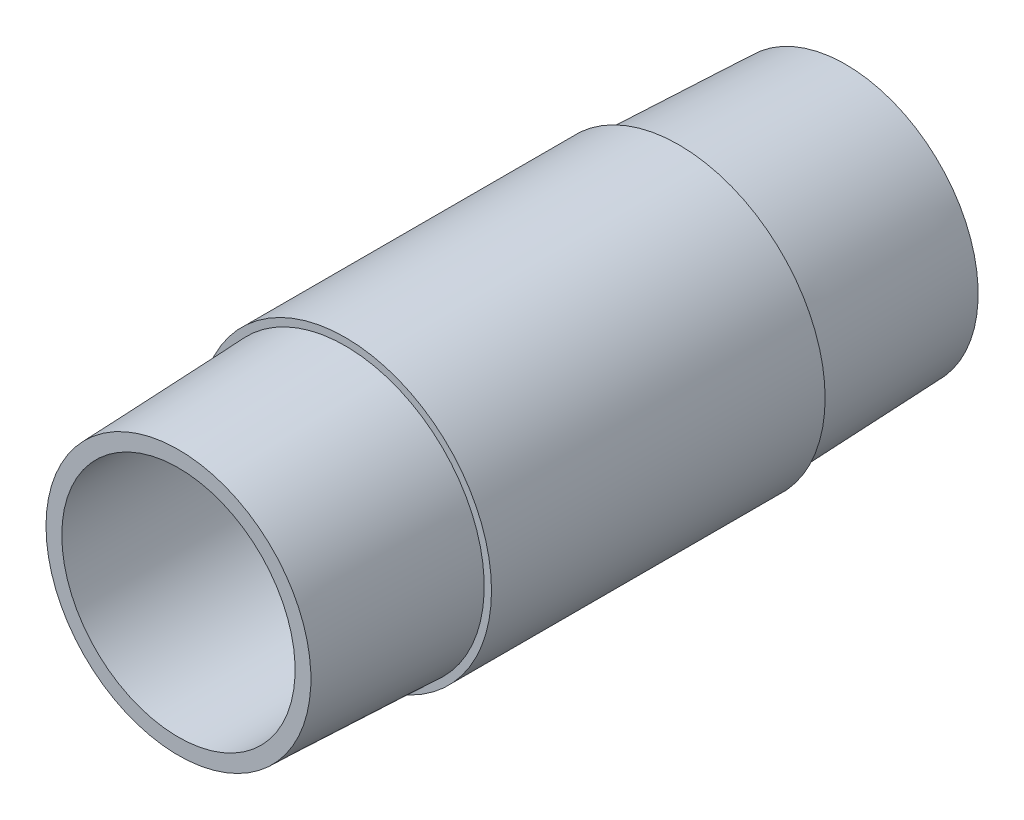
ISO-10303-21;
HEADER;
FILE_DESCRIPTION(('STEP AP214'),'2;1');
FILE_NAME('part.step','',(''),(''),'','','');
FILE_SCHEMA(('AUTOMOTIVE_DESIGN { 1 0 10303 214 1 1 1 1 }'));
ENDSEC;
DATA;
#1=APPLICATION_CONTEXT('core data for automotive mechanical design processes');
#2=APPLICATION_PROTOCOL_DEFINITION('international standard','automotive_design',2000,#1);
#3=PRODUCT_CONTEXT('',#1,'mechanical');
#4=PRODUCT('Part','Part','',(#3));
#5=PRODUCT_RELATED_PRODUCT_CATEGORY('part','',(#4));
#6=PRODUCT_DEFINITION_FORMATION('','',#4);
#7=PRODUCT_DEFINITION_CONTEXT('part definition',#1,'design');
#8=PRODUCT_DEFINITION('design','',#6,#7);
#9=PRODUCT_DEFINITION_SHAPE('','',#8);
#10=(LENGTH_UNIT() NAMED_UNIT(*) SI_UNIT(.MILLI.,.METRE.));
#11=(NAMED_UNIT(*) PLANE_ANGLE_UNIT() SI_UNIT($,.RADIAN.));
#12=(NAMED_UNIT(*) SI_UNIT($,.STERADIAN.) SOLID_ANGLE_UNIT());
#13=UNCERTAINTY_MEASURE_WITH_UNIT(LENGTH_MEASURE(1.E-05),#10,'distance_accuracy_value','');
#14=(GEOMETRIC_REPRESENTATION_CONTEXT(3) GLOBAL_UNCERTAINTY_ASSIGNED_CONTEXT((#13)) GLOBAL_UNIT_ASSIGNED_CONTEXT((#10,
#11,#12)) REPRESENTATION_CONTEXT('',''));
#15=CARTESIAN_POINT('',(0.,0.,0.));
#16=DIRECTION('',(0.,0.,1.));
#17=DIRECTION('',(1.,0.,0.));
#18=AXIS2_PLACEMENT_3D('',#15,#16,#17);
#19=CARTESIAN_POINT('',(0.,0.,76.2));
#20=DIRECTION('',(0.,0.,1.));
#21=DIRECTION('',(1.,0.,0.));
#22=AXIS2_PLACEMENT_3D('',#19,#20,#21);
#23=PLANE('',#22);
#24=CARTESIAN_POINT('',(0.,0.,76.2));
#25=DIRECTION('',(0.,0.,-1.));
#26=DIRECTION('',(-1.,0.,0.));
#27=AXIS2_PLACEMENT_3D('',#24,#25,#26);
#28=CIRCLE('',#27,15.1262084529017);
#29=CARTESIAN_POINT('',(-15.1262084529017,0.,76.2));
#30=VERTEX_POINT('',#29);
#31=EDGE_CURVE('E60',#30,#30,#28,.T.);
#32=ORIENTED_EDGE('',*,*,#31,.F.);
#33=EDGE_LOOP('',(#32));
#34=FACE_BOUND('',#33,.T.);
#35=CARTESIAN_POINT('',(0.,0.,76.2));
#36=DIRECTION('',(0.,0.,1.));
#37=DIRECTION('',(1.,0.,0.));
#38=AXIS2_PLACEMENT_3D('',#35,#36,#37);
#39=CIRCLE('',#38,13.3223);
#40=CARTESIAN_POINT('',(-13.3223,0.,76.2));
#41=VERTEX_POINT('',#40);
#42=EDGE_CURVE('E10',#41,#41,#39,.T.);
#43=ORIENTED_EDGE('',*,*,#42,.F.);
#44=EDGE_LOOP('',(#43));
#45=FACE_BOUND('',#44,.T.);
#46=ADVANCED_FACE('F31',(#34,#45),#23,.T.);
#47=CARTESIAN_POINT('',(0.,0.,0.));
#48=DIRECTION('',(0.,0.,1.));
#49=DIRECTION('',(1.,0.,0.));
#50=AXIS2_PLACEMENT_3D('',#47,#48,#49);
#51=PLANE('',#50);
#52=CARTESIAN_POINT('',(0.,0.,0.));
#53=DIRECTION('',(0.,0.,-1.));
#54=DIRECTION('',(-1.,0.,0.));
#55=AXIS2_PLACEMENT_3D('',#52,#53,#54);
#56=CIRCLE('',#55,15.1262084529017);
#57=CARTESIAN_POINT('',(-15.1262084529017,0.,0.));
#58=VERTEX_POINT('',#57);
#59=EDGE_CURVE('E53',#58,#58,#56,.T.);
#60=ORIENTED_EDGE('',*,*,#59,.T.);
#61=EDGE_LOOP('',(#60));
#62=FACE_BOUND('',#61,.T.);
#63=CARTESIAN_POINT('',(0.,0.,0.));
#64=DIRECTION('',(0.,0.,1.));
#65=DIRECTION('',(1.,0.,0.));
#66=AXIS2_PLACEMENT_3D('',#63,#64,#65);
#67=CIRCLE('',#66,13.3223);
#68=CARTESIAN_POINT('',(-13.3223,0.,0.));
#69=VERTEX_POINT('',#68);
#70=EDGE_CURVE('E39',#69,#69,#67,.T.);
#71=ORIENTED_EDGE('',*,*,#70,.T.);
#72=EDGE_LOOP('',(#71));
#73=FACE_BOUND('',#72,.T.);
#74=ADVANCED_FACE('F79',(#62,#73),#51,.F.);
#75=CARTESIAN_POINT('',(0.,0.,76.2));
#76=DIRECTION('',(0.,0.,-1.));
#77=DIRECTION('',(-1.,0.,0.));
#78=AXIS2_PLACEMENT_3D('',#75,#76,#77);
#79=CYLINDRICAL_SURFACE('',#78,16.7005);
#80=CARTESIAN_POINT('',(0.,0.,57.1500000000001));
#81=DIRECTION('',(0.,0.,-1.));
#82=DIRECTION('',(-1.,0.,0.));
#83=AXIS2_PLACEMENT_3D('',#80,#81,#82);
#84=CIRCLE('',#83,16.7005);
#85=CARTESIAN_POINT('',(-16.7005,0.,57.1500000000001));
#86=VERTEX_POINT('',#85);
#87=EDGE_CURVE('E35',#86,#86,#84,.T.);
#88=CARTESIAN_POINT('',(0.,0.,19.05));
#89=DIRECTION('',(0.,0.,1.));
#90=DIRECTION('',(1.,0.,0.));
#91=AXIS2_PLACEMENT_3D('',#88,#89,#90);
#92=CIRCLE('',#91,16.7005);
#93=CARTESIAN_POINT('',(-16.7005,0.,19.05));
#94=VERTEX_POINT('',#93);
#95=EDGE_CURVE('E44',#94,#94,#92,.T.);
#96=CARTESIAN_POINT('',(-16.7005,0.,57.1500000000001));
#97=CARTESIAN_POINT('',(-16.7005,0.,56.7531250000001));
#98=CARTESIAN_POINT('',(-16.7005,0.,56.3562500000001));
#99=CARTESIAN_POINT('',(-16.7005,0.,55.5625000000001));
#100=CARTESIAN_POINT('',(-16.7005,0.,55.1656250000001));
#101=CARTESIAN_POINT('',(-16.7005,0.,54.3718750000001));
#102=CARTESIAN_POINT('',(-16.7005,0.,53.9750000000001));
#103=CARTESIAN_POINT('',(-16.7005,0.,53.1812500000001));
#104=CARTESIAN_POINT('',(-16.7005,0.,52.7843750000001));
#105=CARTESIAN_POINT('',(-16.7005,0.,51.9906250000001));
#106=CARTESIAN_POINT('',(-16.7005,0.,51.5937500000001));
#107=CARTESIAN_POINT('',(-16.7005,0.,50.8000000000001));
#108=CARTESIAN_POINT('',(-16.7005,0.,50.4031250000001));
#109=CARTESIAN_POINT('',(-16.7005,0.,49.609375));
#110=CARTESIAN_POINT('',(-16.7005,0.,49.2125));
#111=CARTESIAN_POINT('',(-16.7005,0.,48.41875));
#112=CARTESIAN_POINT('',(-16.7005,0.,48.021875));
#113=CARTESIAN_POINT('',(-16.7005,0.,47.228125));
#114=CARTESIAN_POINT('',(-16.7005,0.,46.83125));
#115=CARTESIAN_POINT('',(-16.7005,0.,46.0375));
#116=CARTESIAN_POINT('',(-16.7005,0.,45.640625));
#117=CARTESIAN_POINT('',(-16.7005,0.,44.846875));
#118=CARTESIAN_POINT('',(-16.7005,0.,44.45));
#119=CARTESIAN_POINT('',(-16.7005,0.,43.65625));
#120=CARTESIAN_POINT('',(-16.7005,0.,43.259375));
#121=CARTESIAN_POINT('',(-16.7005,0.,42.465625));
#122=CARTESIAN_POINT('',(-16.7005,0.,42.06875));
#123=CARTESIAN_POINT('',(-16.7005,0.,41.275));
#124=CARTESIAN_POINT('',(-16.7005,0.,40.878125));
#125=CARTESIAN_POINT('',(-16.7005,0.,40.084375));
#126=CARTESIAN_POINT('',(-16.7005,0.,39.6875));
#127=CARTESIAN_POINT('',(-16.7005,0.,38.89375));
#128=CARTESIAN_POINT('',(-16.7005,0.,38.496875));
#129=CARTESIAN_POINT('',(-16.7005,0.,37.703125));
#130=CARTESIAN_POINT('',(-16.7005,0.,37.30625));
#131=CARTESIAN_POINT('',(-16.7005,0.,36.5125));
#132=CARTESIAN_POINT('',(-16.7005,0.,36.115625));
#133=CARTESIAN_POINT('',(-16.7005,0.,35.321875));
#134=CARTESIAN_POINT('',(-16.7005,0.,34.925));
#135=CARTESIAN_POINT('',(-16.7005,0.,34.13125));
#136=CARTESIAN_POINT('',(-16.7005,0.,33.734375));
#137=CARTESIAN_POINT('',(-16.7005,0.,32.940625));
#138=CARTESIAN_POINT('',(-16.7005,0.,32.54375));
#139=CARTESIAN_POINT('',(-16.7005,0.,31.75));
#140=CARTESIAN_POINT('',(-16.7005,0.,31.353125));
#141=CARTESIAN_POINT('',(-16.7005,0.,30.559375));
#142=CARTESIAN_POINT('',(-16.7005,0.,30.1625));
#143=CARTESIAN_POINT('',(-16.7005,0.,29.36875));
#144=CARTESIAN_POINT('',(-16.7005,0.,28.971875));
#145=CARTESIAN_POINT('',(-16.7005,0.,28.178125));
#146=CARTESIAN_POINT('',(-16.7005,0.,27.78125));
#147=CARTESIAN_POINT('',(-16.7005,0.,26.9875));
#148=CARTESIAN_POINT('',(-16.7005,0.,26.590625));
#149=CARTESIAN_POINT('',(-16.7005,0.,25.796875));
#150=CARTESIAN_POINT('',(-16.7005,0.,25.4));
#151=CARTESIAN_POINT('',(-16.7005,0.,24.60625));
#152=CARTESIAN_POINT('',(-16.7005,0.,24.209375));
#153=CARTESIAN_POINT('',(-16.7005,0.,23.415625));
#154=CARTESIAN_POINT('',(-16.7005,0.,23.01875));
#155=CARTESIAN_POINT('',(-16.7005,0.,22.225));
#156=CARTESIAN_POINT('',(-16.7005,0.,21.828125));
#157=CARTESIAN_POINT('',(-16.7005,0.,21.034375));
#158=CARTESIAN_POINT('',(-16.7005,0.,20.6375));
#159=CARTESIAN_POINT('',(-16.7005,0.,19.84375));
#160=CARTESIAN_POINT('',(-16.7005,0.,19.446875));
#161=CARTESIAN_POINT('',(-16.7005,0.,19.05));
#162=B_SPLINE_CURVE_WITH_KNOTS('',3,(#96,#97,#98,#99,#100,#101,#102,#103,#104,#105,#106,#107,
#108,#109,#110,#111,#112,#113,#114,#115,#116,#117,#118,#119,#120,#121,#122,#123,#124,#125,#126,
#127,#128,#129,#130,#131,#132,#133,#134,#135,#136,#137,#138,#139,#140,#141,#142,#143,#144,#145,
#146,#147,#148,#149,#150,#151,#152,#153,#154,#155,#156,#157,#158,#159,#160,#161),.UNSPECIFIED.,
.F.,.F.,(4,2,2,2,2,2,2,2,2,2,2,2,2,2,2,2,2,2,2,2,2,2,2,2,2,2,2,2,2,2,2,2,4),(0.,1.190625,
2.38125,3.571875,4.7625,5.953125,7.14375000000001,8.33437500000002,9.52500000000002,10.715625,
11.90625,13.096875,14.2875,15.478125,16.66875,17.859375,19.05,20.240625,21.43125,22.621875,
23.8125,25.003125,26.1937500000001,27.3843750000001,28.5750000000001,29.7656250000001,
30.9562500000001,32.1468750000001,33.3375000000001,34.5281250000001,35.7187500000001,
36.9093750000001,38.1000000000001),.UNSPECIFIED.);
#163=EDGE_CURVE('BSEAM33',#86,#94,#162,.T.);
#164=ORIENTED_EDGE('',*,*,#87,.T.);
#165=ORIENTED_EDGE('',*,*,#95,.T.);
#166=ORIENTED_EDGE('',*,*,#163,.T.);
#167=ORIENTED_EDGE('',*,*,#163,.F.);
#168=EDGE_LOOP('',(#164,#166,#165,#167));
#169=FACE_BOUND('',#168,.T.);
#170=ADVANCED_FACE('F33',(#169),#79,.T.);
#171=CARTESIAN_POINT('',(0.,0.,76.2));
#172=DIRECTION('',(0.,0.,-1.));
#173=DIRECTION('',(-1.,0.,0.));
#174=AXIS2_PLACEMENT_3D('',#171,#172,#173);
#175=CYLINDRICAL_SURFACE('',#174,13.3223);
#176=CARTESIAN_POINT('',(-13.3223,0.,76.2));
#177=CARTESIAN_POINT('',(-13.3223,0.,75.40625));
#178=CARTESIAN_POINT('',(-13.3223,0.,74.6125));
#179=CARTESIAN_POINT('',(-13.3223,0.,73.025));
#180=CARTESIAN_POINT('',(-13.3223,0.,72.23125));
#181=CARTESIAN_POINT('',(-13.3223,0.,70.64375));
#182=CARTESIAN_POINT('',(-13.3223,0.,69.85));
#183=CARTESIAN_POINT('',(-13.3223,0.,68.2625));
#184=CARTESIAN_POINT('',(-13.3223,0.,67.46875));
#185=CARTESIAN_POINT('',(-13.3223,0.,65.88125));
#186=CARTESIAN_POINT('',(-13.3223,0.,65.0875));
#187=CARTESIAN_POINT('',(-13.3223,0.,63.5));
#188=CARTESIAN_POINT('',(-13.3223,0.,62.70625));
#189=CARTESIAN_POINT('',(-13.3223,0.,61.11875));
#190=CARTESIAN_POINT('',(-13.3223,0.,60.325));
#191=CARTESIAN_POINT('',(-13.3223,0.,58.7375));
#192=CARTESIAN_POINT('',(-13.3223,0.,57.94375));
#193=CARTESIAN_POINT('',(-13.3223,0.,56.35625));
#194=CARTESIAN_POINT('',(-13.3223,0.,55.5625));
#195=CARTESIAN_POINT('',(-13.3223,0.,53.975));
#196=CARTESIAN_POINT('',(-13.3223,0.,53.18125));
#197=CARTESIAN_POINT('',(-13.3223,0.,51.59375));
#198=CARTESIAN_POINT('',(-13.3223,0.,50.8));
#199=CARTESIAN_POINT('',(-13.3223,0.,49.2125));
#200=CARTESIAN_POINT('',(-13.3223,0.,48.41875));
#201=CARTESIAN_POINT('',(-13.3223,0.,46.83125));
#202=CARTESIAN_POINT('',(-13.3223,0.,46.0375));
#203=CARTESIAN_POINT('',(-13.3223,0.,44.45));
#204=CARTESIAN_POINT('',(-13.3223,0.,43.65625));
#205=CARTESIAN_POINT('',(-13.3223,0.,42.06875));
#206=CARTESIAN_POINT('',(-13.3223,0.,41.275));
#207=CARTESIAN_POINT('',(-13.3223,0.,39.6875));
#208=CARTESIAN_POINT('',(-13.3223,0.,38.89375));
#209=CARTESIAN_POINT('',(-13.3223,0.,37.30625));
#210=CARTESIAN_POINT('',(-13.3223,0.,36.5125));
#211=CARTESIAN_POINT('',(-13.3223,0.,34.925));
#212=CARTESIAN_POINT('',(-13.3223,0.,34.13125));
#213=CARTESIAN_POINT('',(-13.3223,0.,32.54375));
#214=CARTESIAN_POINT('',(-13.3223,0.,31.75));
#215=CARTESIAN_POINT('',(-13.3223,0.,30.1625));
#216=CARTESIAN_POINT('',(-13.3223,0.,29.36875));
#217=CARTESIAN_POINT('',(-13.3223,0.,27.78125));
#218=CARTESIAN_POINT('',(-13.3223,0.,26.9875));
#219=CARTESIAN_POINT('',(-13.3223,0.,25.4));
#220=CARTESIAN_POINT('',(-13.3223,0.,24.60625));
#221=CARTESIAN_POINT('',(-13.3223,0.,23.01875));
#222=CARTESIAN_POINT('',(-13.3223,0.,22.225));
#223=CARTESIAN_POINT('',(-13.3223,0.,20.6375));
#224=CARTESIAN_POINT('',(-13.3223,0.,19.84375));
#225=CARTESIAN_POINT('',(-13.3223,0.,18.25625));
#226=CARTESIAN_POINT('',(-13.3223,0.,17.4625));
#227=CARTESIAN_POINT('',(-13.3223,0.,15.875));
#228=CARTESIAN_POINT('',(-13.3223,0.,15.08125));
#229=CARTESIAN_POINT('',(-13.3223,0.,13.49375));
#230=CARTESIAN_POINT('',(-13.3223,0.,12.7));
#231=CARTESIAN_POINT('',(-13.3223,0.,11.1125));
#232=CARTESIAN_POINT('',(-13.3223,0.,10.31875));
#233=CARTESIAN_POINT('',(-13.3223,0.,8.73125));
#234=CARTESIAN_POINT('',(-13.3223,0.,7.93750000000001));
#235=CARTESIAN_POINT('',(-13.3223,0.,6.35));
#236=CARTESIAN_POINT('',(-13.3223,0.,5.55625));
#237=CARTESIAN_POINT('',(-13.3223,0.,3.96875));
#238=CARTESIAN_POINT('',(-13.3223,0.,3.175));
#239=CARTESIAN_POINT('',(-13.3223,0.,1.5875));
#240=CARTESIAN_POINT('',(-13.3223,0.,0.793750000000001));
#241=CARTESIAN_POINT('',(-13.3223,0.,0.));
#242=B_SPLINE_CURVE_WITH_KNOTS('',3,(#176,#177,#178,#179,#180,#181,#182,#183,#184,#185,#186,
#187,#188,#189,#190,#191,#192,#193,#194,#195,#196,#197,#198,#199,#200,#201,#202,#203,#204,#205,
#206,#207,#208,#209,#210,#211,#212,#213,#214,#215,#216,#217,#218,#219,#220,#221,#222,#223,#224,
#225,#226,#227,#228,#229,#230,#231,#232,#233,#234,#235,#236,#237,#238,#239,#240,#241),
.UNSPECIFIED.,.F.,.F.,(4,2,2,2,2,2,2,2,2,2,2,2,2,2,2,2,2,2,2,2,2,2,2,2,2,2,2,2,2,2,2,2,4),(0.,
2.38125,4.7625,7.14375,9.52500000000001,11.90625,14.2875,16.66875,19.05,21.43125,23.8125,
26.19375,28.575,30.95625,33.3375,35.71875,38.1,40.48125,42.8625,45.24375,47.625,50.00625,
52.3875,54.76875,57.15,59.53125,61.9125,64.29375,66.675,69.05625,71.4375,73.81875,76.2),.UNSPECIFIED.);
#243=EDGE_CURVE('BSEAM86',#41,#69,#242,.T.);
#244=ORIENTED_EDGE('',*,*,#42,.T.);
#245=ORIENTED_EDGE('',*,*,#70,.F.);
#246=ORIENTED_EDGE('',*,*,#243,.T.);
#247=ORIENTED_EDGE('',*,*,#243,.F.);
#248=EDGE_LOOP('',(#244,#246,#245,#247));
#249=FACE_BOUND('',#248,.T.);
#250=ADVANCED_FACE('F86',(#249),#175,.F.);
#251=CARTESIAN_POINT('',(0.,16.7005,19.05));
#252=DIRECTION('',(0.,0.,1.));
#253=DIRECTION('',(1.,0.,0.));
#254=AXIS2_PLACEMENT_3D('',#251,#252,#253);
#255=PLANE('',#254);
#256=CARTESIAN_POINT('',(0.,0.,19.05));
#257=DIRECTION('',(0.,0.,-1.));
#258=DIRECTION('',(-1.,0.,0.));
#259=AXIS2_PLACEMENT_3D('',#256,#257,#258);
#260=CIRCLE('',#259,15.8692502716407);
#261=CARTESIAN_POINT('',(-15.8692502716407,0.,19.05));
#262=VERTEX_POINT('',#261);
#263=EDGE_CURVE('E47',#262,#262,#260,.T.);
#264=ORIENTED_EDGE('',*,*,#263,.F.);
#265=EDGE_LOOP('',(#264));
#266=FACE_BOUND('',#265,.T.);
#267=ORIENTED_EDGE('',*,*,#95,.F.);
#268=EDGE_LOOP('',(#267));
#269=FACE_BOUND('',#268,.T.);
#270=ADVANCED_FACE('F89',(#266,#269),#255,.F.);
#271=CARTESIAN_POINT('',(0.,0.,19.05));
#272=DIRECTION('',(0.,0.,1.));
#273=DIRECTION('',(1.,0.,0.));
#274=AXIS2_PLACEMENT_3D('',#271,#272,#273);
#275=CONICAL_SURFACE('',#274,15.8692502716407,0.0389850575857642);
#276=ORIENTED_EDGE('',*,*,#59,.F.);
#277=EDGE_LOOP('',(#276));
#278=FACE_BOUND('',#277,.T.);
#279=ORIENTED_EDGE('',*,*,#263,.T.);
#280=EDGE_LOOP('',(#279));
#281=FACE_BOUND('',#280,.T.);
#282=ADVANCED_FACE('F92',(#278,#281),#275,.T.);
#283=CARTESIAN_POINT('',(0.,16.7005,57.1500000000001));
#284=DIRECTION('',(0.,0.,-1.));
#285=DIRECTION('',(-1.,0.,0.));
#286=AXIS2_PLACEMENT_3D('',#283,#284,#285);
#287=PLANE('',#286);
#288=CARTESIAN_POINT('',(0.,0.,57.1500000000001));
#289=DIRECTION('',(0.,0.,-1.));
#290=DIRECTION('',(-1.,0.,0.));
#291=AXIS2_PLACEMENT_3D('',#288,#289,#290);
#292=CIRCLE('',#291,15.8692502716407);
#293=CARTESIAN_POINT('',(-15.8692502716407,0.,57.1500000000001));
#294=VERTEX_POINT('',#293);
#295=EDGE_CURVE('E64',#294,#294,#292,.T.);
#296=ORIENTED_EDGE('',*,*,#295,.T.);
#297=EDGE_LOOP('',(#296));
#298=FACE_BOUND('',#297,.T.);
#299=ORIENTED_EDGE('',*,*,#87,.F.);
#300=EDGE_LOOP('',(#299));
#301=FACE_BOUND('',#300,.T.);
#302=ADVANCED_FACE('F68',(#298,#301),#287,.F.);
#303=CARTESIAN_POINT('',(0.,0.,76.2));
#304=DIRECTION('',(0.,0.,-1.));
#305=DIRECTION('',(-1.,0.,0.));
#306=AXIS2_PLACEMENT_3D('',#303,#304,#305);
#307=CONICAL_SURFACE('',#306,15.1262084529017,0.0389850575857609);
#308=ORIENTED_EDGE('',*,*,#295,.F.);
#309=EDGE_LOOP('',(#308));
#310=FACE_BOUND('',#309,.T.);
#311=ORIENTED_EDGE('',*,*,#31,.T.);
#312=EDGE_LOOP('',(#311));
#313=FACE_BOUND('',#312,.T.);
#314=ADVANCED_FACE('F71',(#310,#313),#307,.T.);
#315=CLOSED_SHELL('',(#46,#74,#170,#250,#270,#282,#302,#314));
#316=MANIFOLD_SOLID_BREP('B2',#315);
#317=ADVANCED_BREP_SHAPE_REPRESENTATION('',(#18,#316),#14);
#318=SHAPE_DEFINITION_REPRESENTATION(#9,#317);
ENDSEC;
END-ISO-10303-21;
